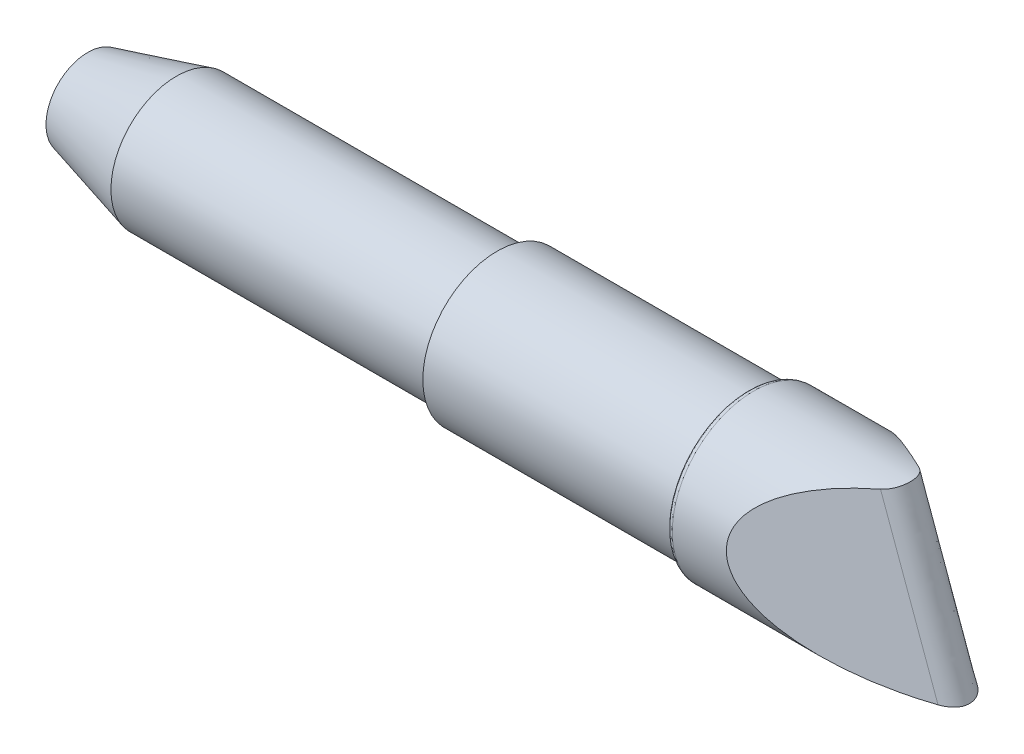
ISO-10303-21;
HEADER;
FILE_DESCRIPTION(('STEP AP214'),'2;1');
FILE_NAME('part.step','',(''),(''),'','','');
FILE_SCHEMA(('AUTOMOTIVE_DESIGN { 1 0 10303 214 1 1 1 1 }'));
ENDSEC;
DATA;
#1=APPLICATION_CONTEXT('core data for automotive mechanical design processes');
#2=APPLICATION_PROTOCOL_DEFINITION('international standard','automotive_design',2000,#1);
#3=PRODUCT_CONTEXT('',#1,'mechanical');
#4=PRODUCT('Part','Part','',(#3));
#5=PRODUCT_RELATED_PRODUCT_CATEGORY('part','',(#4));
#6=PRODUCT_DEFINITION_FORMATION('','',#4);
#7=PRODUCT_DEFINITION_CONTEXT('part definition',#1,'design');
#8=PRODUCT_DEFINITION('design','',#6,#7);
#9=PRODUCT_DEFINITION_SHAPE('','',#8);
#10=(LENGTH_UNIT() NAMED_UNIT(*) SI_UNIT(.MILLI.,.METRE.));
#11=(NAMED_UNIT(*) PLANE_ANGLE_UNIT() SI_UNIT($,.RADIAN.));
#12=(NAMED_UNIT(*) SI_UNIT($,.STERADIAN.) SOLID_ANGLE_UNIT());
#13=UNCERTAINTY_MEASURE_WITH_UNIT(LENGTH_MEASURE(1.E-05),#10,'distance_accuracy_value','');
#14=(GEOMETRIC_REPRESENTATION_CONTEXT(3) GLOBAL_UNCERTAINTY_ASSIGNED_CONTEXT((#13)) GLOBAL_UNIT_ASSIGNED_CONTEXT((#10,
#11,#12)) REPRESENTATION_CONTEXT('',''));
#15=CARTESIAN_POINT('',(0.,0.,0.));
#16=DIRECTION('',(0.,0.,1.));
#17=DIRECTION('',(1.,0.,0.));
#18=AXIS2_PLACEMENT_3D('',#15,#16,#17);
#19=CARTESIAN_POINT('',(0.,0.,0.));
#20=DIRECTION('',(-1.,0.,0.));
#21=DIRECTION('',(0.,0.,1.));
#22=AXIS2_PLACEMENT_3D('',#19,#20,#21);
#23=CYLINDRICAL_SURFACE('',#22,2.6);
#24=CARTESIAN_POINT('',(21.29,0.,0.));
#25=DIRECTION('',(1.,0.,0.));
#26=DIRECTION('',(0.,0.,-1.));
#27=AXIS2_PLACEMENT_3D('',#24,#25,#26);
#28=CIRCLE('',#27,2.6);
#29=CARTESIAN_POINT('',(21.29,0.,-2.6));
#30=VERTEX_POINT('',#29);
#31=EDGE_CURVE('E13',#30,#30,#28,.T.);
#32=ORIENTED_EDGE('',*,*,#31,.T.);
#33=EDGE_LOOP('',(#32));
#34=FACE_BOUND('',#33,.T.);
#35=CARTESIAN_POINT('',(28.0536557345995,0.,0.));
#36=DIRECTION('',(0.456846412916202,0.166278495932785,-0.873866589815591));
#37=DIRECTION('',(-0.889545589054097,0.0853961116178096,-0.448794105481522));
#38=AXIS2_PLACEMENT_3D('',#35,#36,#37);
#39=ELLIPSE('',#38,5.69119057628873,2.6);
#40=CARTESIAN_POINT('',(27.8027856939557,-2.52695141325544,-0.611977577241465));
#41=VERTEX_POINT('',#40);
#42=CARTESIAN_POINT('',(25.9633154982319,2.52695141325544,-0.611977577241465));
#43=VERTEX_POINT('',#42);
#44=EDGE_CURVE('E84',#41,#43,#39,.T.);
#45=ORIENTED_EDGE('',*,*,#44,.F.);
#46=CARTESIAN_POINT('',(27.8027856939557,-2.52695141325544,0.611977577241463));
#47=CARTESIAN_POINT('',(27.8400901935534,-2.53146118736888,0.593331610000817));
#48=CARTESIAN_POINT('',(27.8758216067536,-2.53650225032879,0.571642818112571));
#49=CARTESIAN_POINT('',(27.9431931254533,-2.54703506865313,0.522728383535641));
#50=CARTESIAN_POINT('',(27.9748330847233,-2.55252684011452,0.495502543041025));
#51=CARTESIAN_POINT('',(28.0318894699332,-2.5631287226502,0.437272863863251));
#52=CARTESIAN_POINT('',(28.0575066686138,-2.56824527227087,0.406467702145234));
#53=CARTESIAN_POINT('',(28.1019234209073,-2.57750903727589,0.342675849790038));
#54=CARTESIAN_POINT('',(28.1210212343363,-2.58169416779814,0.309903419535485));
#55=CARTESIAN_POINT('',(28.152598142513,-2.58879403434075,0.243319226142334));
#56=CARTESIAN_POINT('',(28.1653756308877,-2.59176456963821,0.209655834476601));
#57=CARTESIAN_POINT('',(28.1847914938158,-2.59633561683875,0.141938214037401));
#58=CARTESIAN_POINT('',(28.1916510741516,-2.59798531038945,0.107951144894187));
#59=CARTESIAN_POINT('',(28.199704175966,-2.59992610418472,0.0394155921825002));
#60=CARTESIAN_POINT('',(28.2009218983865,-2.60022300717942,0.00487014559501363));
#61=CARTESIAN_POINT('',(28.1976900041404,-2.59944094302108,-0.0639870515541633));
#62=CARTESIAN_POINT('',(28.193232072577,-2.59835995724279,-0.0982983850399568));
#63=CARTESIAN_POINT('',(28.1788507841079,-2.59493180624083,-0.165748330106863));
#64=CARTESIAN_POINT('',(28.1689170418236,-2.59258223520284,-0.198884585547103));
#65=CARTESIAN_POINT('',(28.144051770088,-2.58685761500973,-0.263070862745175));
#66=CARTESIAN_POINT('',(28.129125822662,-2.58348371159707,-0.294123168312324));
#67=CARTESIAN_POINT('',(28.0940373204973,-2.57584545293368,-0.354972087713623));
#68=CARTESIAN_POINT('',(28.0736612761392,-2.57154664848785,-0.384640718335496));
#69=CARTESIAN_POINT('',(28.0285111363187,-2.5625161794337,-0.440828226301679));
#70=CARTESIAN_POINT('',(28.0036946820489,-2.55778057997874,-0.467312248603793));
#71=CARTESIAN_POINT('',(27.9504442065932,-2.54832439863193,-0.516401101112708));
#72=CARTESIAN_POINT('',(27.9220066955186,-2.54360383579132,-0.539002138960786));
#73=CARTESIAN_POINT('',(27.8635771044514,-2.53479781739937,-0.57895943518035));
#74=CARTESIAN_POINT('',(27.8337236153215,-2.5306928194048,-0.596514253177159));
#75=CARTESIAN_POINT('',(27.8027856939557,-2.52695141325544,-0.611977577241465));
#76=B_SPLINE_CURVE_WITH_KNOTS('',3,(#46,#47,#48,#49,#50,#51,#52,#53,#54,#55,#56,#57,#58,#59,#60,
#61,#62,#63,#64,#65,#66,#67,#68,#69,#70,#71,#72,#73,#74,#75),.UNSPECIFIED.,.F.,.F.,(4,2,2,2,2,2,
2,2,2,2,2,2,2,2,4),(0.,0.125725408910746,0.251455310034455,0.372071924892683,0.486031033575065,
0.593919336373701,0.697574491879551,0.800784600855184,0.904146087932532,1.00770428744138,
1.11114707850227,1.21946087160358,1.32886909732564,1.43838357772376,1.54268103768934),.UNSPECIFIED.);
#77=CARTESIAN_POINT('',(27.8027856939557,-2.52695141325544,0.611977577241463));
#78=VERTEX_POINT('',#77);
#79=EDGE_CURVE('E70',#78,#41,#76,.T.);
#80=ORIENTED_EDGE('',*,*,#79,.F.);
#81=CARTESIAN_POINT('',(28.0536557345995,0.,0.));
#82=DIRECTION('',(0.456846412916202,0.166278495932785,0.873866589815591));
#83=DIRECTION('',(-0.889545589054096,0.0853961116178097,0.448794105481522));
#84=AXIS2_PLACEMENT_3D('',#81,#82,#83);
#85=ELLIPSE('',#84,5.69119057628873,2.6);
#86=CARTESIAN_POINT('',(25.9633154982319,2.52695141325544,0.611977577241463));
#87=VERTEX_POINT('',#86);
#88=EDGE_CURVE('E79',#87,#78,#85,.T.);
#89=ORIENTED_EDGE('',*,*,#88,.F.);
#90=CARTESIAN_POINT('',(25.9633154982319,2.52695141325544,-0.611977577241465));
#91=CARTESIAN_POINT('',(25.9793100378148,2.52907344259097,-0.603213160864123));
#92=CARTESIAN_POINT('',(25.9948984169694,2.53131548205581,-0.593758082386445));
#93=CARTESIAN_POINT('',(26.0251695207153,2.53597251935582,-0.573543211745481));
#94=CARTESIAN_POINT('',(26.0398525717652,2.53838745415851,-0.562783894087234));
#95=CARTESIAN_POINT('',(26.0822476182426,2.54576341938964,-0.528792972279206));
#96=CARTESIAN_POINT('',(26.1085027581431,2.55088313040515,-0.503739567507232));
#97=CARTESIAN_POINT('',(26.1561627489174,2.56091217821349,-0.449963142848558));
#98=CARTESIAN_POINT('',(26.1776247408443,2.56582335670683,-0.421290538627965));
#99=CARTESIAN_POINT('',(26.2157980866081,2.57501658015841,-0.360863374623843));
#100=CARTESIAN_POINT('',(26.2325104597992,2.57929876001569,-0.329109478106824));
#101=CARTESIAN_POINT('',(26.2609909491414,2.58683910667111,-0.263359544213447));
#102=CARTESIAN_POINT('',(26.272759887347,2.59009744370359,-0.229363880714111));
#103=CARTESIAN_POINT('',(26.2913630298579,2.59533876446973,-0.159546735637866));
#104=CARTESIAN_POINT('',(26.2981406284267,2.59730709172418,-0.123709097918233));
#105=CARTESIAN_POINT('',(26.3064988089999,2.59974434330666,-0.0513805425816521));
#106=CARTESIAN_POINT('',(26.3080782120855,2.60021292750154,-0.0148894786581253));
#107=CARTESIAN_POINT('',(26.3059118597551,2.59957554739793,0.0619567284808713));
#108=CARTESIAN_POINT('',(26.3015606477322,2.59829054184061,0.102294953611109));
#109=CARTESIAN_POINT('',(26.2865629945831,2.59397820277937,0.181157865791129));
#110=CARTESIAN_POINT('',(26.2759967465069,2.59097307714613,0.219699021984214));
#111=CARTESIAN_POINT('',(26.2490745665455,2.58364320534674,0.293474642043973));
#112=CARTESIAN_POINT('',(26.2328707300809,2.57935350225716,0.328767848069451));
#113=CARTESIAN_POINT('',(26.1954591405,2.57003830780599,0.394948349793724));
#114=CARTESIAN_POINT('',(26.1744332261514,2.56504161187476,0.425942285073428));
#115=CARTESIAN_POINT('',(26.1282536068028,2.55492284958031,0.482883831081383));
#116=CARTESIAN_POINT('',(26.1032693852051,2.54981122889068,0.508969711596505));
#117=CARTESIAN_POINT('',(26.0589857910873,2.54165307341724,0.547943808495246));
#118=CARTESIAN_POINT('',(26.0408873093619,2.5385268195741,0.562198141941194));
#119=CARTESIAN_POINT('',(26.0031836775974,2.53251919976006,0.588667736296579));
#120=CARTESIAN_POINT('',(25.9835766012075,2.5296381571266,0.600880324784844));
#121=CARTESIAN_POINT('',(25.9633154982319,2.52695141325542,0.611977577241453));
#122=B_SPLINE_CURVE_WITH_KNOTS('',3,(#90,#91,#92,#93,#94,#95,#96,#97,#98,#99,#100,#101,#102,
#103,#104,#105,#106,#107,#108,#109,#110,#111,#112,#113,#114,#115,#116,#117,#118,#119,#120,#121),
.UNSPECIFIED.,.F.,.F.,(4,2,2,2,2,2,2,2,2,2,2,2,2,2,2,4),(0.,0.0550471368205466,
0.110074306300346,0.219456889360805,0.327456140464565,0.435432195439815,0.543390287726561,
0.652554611734928,0.761743691833984,0.882954703602014,1.00263500547059,1.11930910651814,
1.23215095974736,1.34105838916329,1.41067535046316,1.48038273122439),.UNSPECIFIED.);
#123=EDGE_CURVE('E65',#43,#87,#122,.T.);
#124=ORIENTED_EDGE('',*,*,#123,.F.);
#125=EDGE_LOOP('',(#45,#80,#89,#124));
#126=FACE_BOUND('',#125,.T.);
#127=ADVANCED_FACE('F49',(#34,#126),#23,.T.);
#128=CARTESIAN_POINT('',(0.,0.,0.));
#129=DIRECTION('',(1.,0.,0.));
#130=DIRECTION('',(0.,0.,-1.));
#131=AXIS2_PLACEMENT_3D('',#128,#129,#130);
#132=PLANE('',#131);
#133=CARTESIAN_POINT('',(0.,0.,0.));
#134=DIRECTION('',(-1.,0.,0.));
#135=DIRECTION('',(0.,0.,1.));
#136=AXIS2_PLACEMENT_3D('',#133,#134,#135);
#137=CIRCLE('',#136,1.335);
#138=CARTESIAN_POINT('',(0.,0.,1.335));
#139=VERTEX_POINT('',#138);
#140=EDGE_CURVE('E85',#139,#139,#137,.T.);
#141=ORIENTED_EDGE('',*,*,#140,.T.);
#142=EDGE_LOOP('',(#141));
#143=FACE_BOUND('',#142,.T.);
#144=ADVANCED_FACE('F163',(#143),#132,.F.);
#145=CARTESIAN_POINT('',(2.83635861375234,0.,0.));
#146=DIRECTION('',(1.,0.,0.));
#147=DIRECTION('',(0.,0.,-1.));
#148=AXIS2_PLACEMENT_3D('',#145,#146,#147);
#149=CONICAL_SURFACE('',#148,2.095,0.26179938779915);
#150=ORIENTED_EDGE('',*,*,#140,.F.);
#151=EDGE_LOOP('',(#150));
#152=FACE_BOUND('',#151,.T.);
#153=CARTESIAN_POINT('',(2.83635861375234,0.,0.));
#154=DIRECTION('',(-1.,0.,0.));
#155=DIRECTION('',(0.,0.,1.));
#156=AXIS2_PLACEMENT_3D('',#153,#154,#155);
#157=CIRCLE('',#156,2.095);
#158=CARTESIAN_POINT('',(2.83635861375234,0.,2.095));
#159=VERTEX_POINT('',#158);
#160=EDGE_CURVE('E136',#159,#159,#157,.T.);
#161=ORIENTED_EDGE('',*,*,#160,.T.);
#162=EDGE_LOOP('',(#161));
#163=FACE_BOUND('',#162,.T.);
#164=ADVANCED_FACE('F168',(#152,#163),#149,.T.);
#165=CARTESIAN_POINT('',(0.,0.,0.));
#166=DIRECTION('',(-1.,0.,0.));
#167=DIRECTION('',(0.,0.,1.));
#168=AXIS2_PLACEMENT_3D('',#165,#166,#167);
#169=CYLINDRICAL_SURFACE('',#168,2.095);
#170=ORIENTED_EDGE('',*,*,#160,.F.);
#171=EDGE_LOOP('',(#170));
#172=FACE_BOUND('',#171,.T.);
#173=CARTESIAN_POINT('',(13.09,0.,0.));
#174=DIRECTION('',(-1.,0.,0.));
#175=DIRECTION('',(0.,0.,1.));
#176=AXIS2_PLACEMENT_3D('',#173,#174,#175);
#177=CIRCLE('',#176,2.095);
#178=CARTESIAN_POINT('',(13.09,0.,2.095));
#179=VERTEX_POINT('',#178);
#180=EDGE_CURVE('E140',#179,#179,#177,.T.);
#181=ORIENTED_EDGE('',*,*,#180,.T.);
#182=EDGE_LOOP('',(#181));
#183=FACE_BOUND('',#182,.T.);
#184=ADVANCED_FACE('F210',(#172,#183),#169,.T.);
#185=CARTESIAN_POINT('',(13.09,2.095,0.));
#186=DIRECTION('',(1.,0.,0.));
#187=DIRECTION('',(0.,0.,-1.));
#188=AXIS2_PLACEMENT_3D('',#185,#186,#187);
#189=PLANE('',#188);
#190=ORIENTED_EDGE('',*,*,#180,.F.);
#191=EDGE_LOOP('',(#190));
#192=FACE_BOUND('',#191,.T.);
#193=CARTESIAN_POINT('',(13.09,0.,0.));
#194=DIRECTION('',(-1.,0.,0.));
#195=DIRECTION('',(0.,0.,1.));
#196=AXIS2_PLACEMENT_3D('',#193,#194,#195);
#197=CIRCLE('',#196,2.375);
#198=CARTESIAN_POINT('',(13.09,0.,2.375));
#199=VERTEX_POINT('',#198);
#200=EDGE_CURVE('E99',#199,#199,#197,.T.);
#201=ORIENTED_EDGE('',*,*,#200,.T.);
#202=EDGE_LOOP('',(#201));
#203=FACE_BOUND('',#202,.T.);
#204=ADVANCED_FACE('F148',(#192,#203),#189,.F.);
#205=CARTESIAN_POINT('',(0.,0.,0.));
#206=DIRECTION('',(-1.,0.,0.));
#207=DIRECTION('',(0.,0.,1.));
#208=AXIS2_PLACEMENT_3D('',#205,#206,#207);
#209=CYLINDRICAL_SURFACE('',#208,2.375);
#210=ORIENTED_EDGE('',*,*,#200,.F.);
#211=EDGE_LOOP('',(#210));
#212=FACE_BOUND('',#211,.T.);
#213=CARTESIAN_POINT('',(21.09,0.,0.));
#214=DIRECTION('',(-1.,0.,0.));
#215=DIRECTION('',(0.,0.,1.));
#216=AXIS2_PLACEMENT_3D('',#213,#214,#215);
#217=CIRCLE('',#216,2.375);
#218=CARTESIAN_POINT('',(21.09,0.,2.375));
#219=VERTEX_POINT('',#218);
#220=EDGE_CURVE('E93',#219,#219,#217,.T.);
#221=ORIENTED_EDGE('',*,*,#220,.T.);
#222=EDGE_LOOP('',(#221));
#223=FACE_BOUND('',#222,.T.);
#224=ADVANCED_FACE('F150',(#212,#223),#209,.T.);
#225=CARTESIAN_POINT('',(21.09,2.375,0.));
#226=DIRECTION('',(1.,0.,0.));
#227=DIRECTION('',(0.,0.,-1.));
#228=AXIS2_PLACEMENT_3D('',#225,#226,#227);
#229=PLANE('',#228);
#230=CARTESIAN_POINT('',(21.09,0.,0.));
#231=DIRECTION('',(1.,0.,0.));
#232=DIRECTION('',(0.,0.,-1.));
#233=AXIS2_PLACEMENT_3D('',#230,#231,#232);
#234=CIRCLE('',#233,2.4);
#235=CARTESIAN_POINT('',(21.09,0.,-2.4));
#236=VERTEX_POINT('',#235);
#237=EDGE_CURVE('E58',#236,#236,#234,.F.);
#238=ORIENTED_EDGE('',*,*,#237,.T.);
#239=EDGE_LOOP('',(#238));
#240=FACE_BOUND('',#239,.T.);
#241=ORIENTED_EDGE('',*,*,#220,.F.);
#242=EDGE_LOOP('',(#241));
#243=FACE_BOUND('',#242,.T.);
#244=ADVANCED_FACE('F153',(#240,#243),#229,.F.);
#245=CARTESIAN_POINT('',(17.7797985667433,6.79692620785908,-4.07773013486137));
#246=DIRECTION('',(0.456846412916202,0.166278495932785,-0.873866589815591));
#247=DIRECTION('',(-0.886203579231214,0.,-0.463296035119863));
#248=AXIS2_PLACEMENT_3D('',#245,#246,#247);
#249=PLANE('',#248);
#250=ORIENTED_EDGE('',*,*,#44,.T.);
#251=DIRECTION('',(0.342020143325669,-0.939692620785908,0.));
#252=VECTOR('',#251,1.);
#253=CARTESIAN_POINT('',(24.4091717719292,6.79692620785908,-0.611977577241465));
#254=LINE('',#253,#252);
#255=EDGE_CURVE('E89',#43,#41,#254,.T.);
#256=ORIENTED_EDGE('',*,*,#255,.T.);
#257=EDGE_LOOP('',(#250,#256));
#258=FACE_BOUND('',#257,.T.);
#259=ADVANCED_FACE('F121',(#258),#249,.T.);
#260=CARTESIAN_POINT('',(24.4091717719292,6.79692620785908,0.611977577241463));
#261=DIRECTION('',(0.456846412916202,0.166278495932785,0.873866589815591));
#262=DIRECTION('',(0.886203579231214,0.,-0.463296035119863));
#263=AXIS2_PLACEMENT_3D('',#260,#261,#262);
#264=PLANE('',#263);
#265=ORIENTED_EDGE('',*,*,#88,.T.);
#266=DIRECTION('',(0.342020143325669,-0.939692620785908,0.));
#267=VECTOR('',#266,1.);
#268=CARTESIAN_POINT('',(24.4091717719292,6.79692620785908,0.611977577241463));
#269=LINE('',#268,#267);
#270=EDGE_CURVE('E81',#87,#78,#269,.T.);
#271=ORIENTED_EDGE('',*,*,#270,.F.);
#272=EDGE_LOOP('',(#265,#271));
#273=FACE_BOUND('',#272,.T.);
#274=ADVANCED_FACE('F80',(#273),#264,.T.);
#275=CARTESIAN_POINT('',(24.0892376261383,6.79692620785908,0.));
#276=DIRECTION('',(0.,-1.,0.));
#277=DIRECTION('',(0.,0.,-1.));
#278=AXIS2_PLACEMENT_3D('',#275,#276,#277);
#279=CIRCLE('',#278,0.690560940605043);
#280=DIRECTION('',(0.342020143325669,-0.939692620785908,0.));
#281=VECTOR('',#280,1.);
#282=SURFACE_OF_LINEAR_EXTRUSION('',#279,#281);
#283=ORIENTED_EDGE('',*,*,#79,.T.);
#284=ORIENTED_EDGE('',*,*,#255,.F.);
#285=ORIENTED_EDGE('',*,*,#123,.T.);
#286=ORIENTED_EDGE('',*,*,#270,.T.);
#287=EDGE_LOOP('',(#283,#284,#285,#286));
#288=FACE_BOUND('',#287,.T.);
#289=ADVANCED_FACE('F87',(#288),#282,.T.);
#290=CARTESIAN_POINT('',(21.29,0.,0.));
#291=DIRECTION('',(1.,0.,0.));
#292=DIRECTION('',(0.,0.,-1.));
#293=AXIS2_PLACEMENT_3D('',#290,#291,#292);
#294=TOROIDAL_SURFACE('',#293,2.4,0.2);
#295=ORIENTED_EDGE('',*,*,#31,.F.);
#296=EDGE_LOOP('',(#295));
#297=FACE_BOUND('',#296,.T.);
#298=ORIENTED_EDGE('',*,*,#237,.F.);
#299=EDGE_LOOP('',(#298));
#300=FACE_BOUND('',#299,.T.);
#301=ADVANCED_FACE('F51',(#297,#300),#294,.T.);
#302=CLOSED_SHELL('',(#127,#144,#164,#184,#204,#224,#244,#259,#274,#289,#301));
#303=MANIFOLD_SOLID_BREP('B2',#302);
#304=ADVANCED_BREP_SHAPE_REPRESENTATION('',(#18,#303),#14);
#305=SHAPE_DEFINITION_REPRESENTATION(#9,#304);
ENDSEC;
END-ISO-10303-21;
